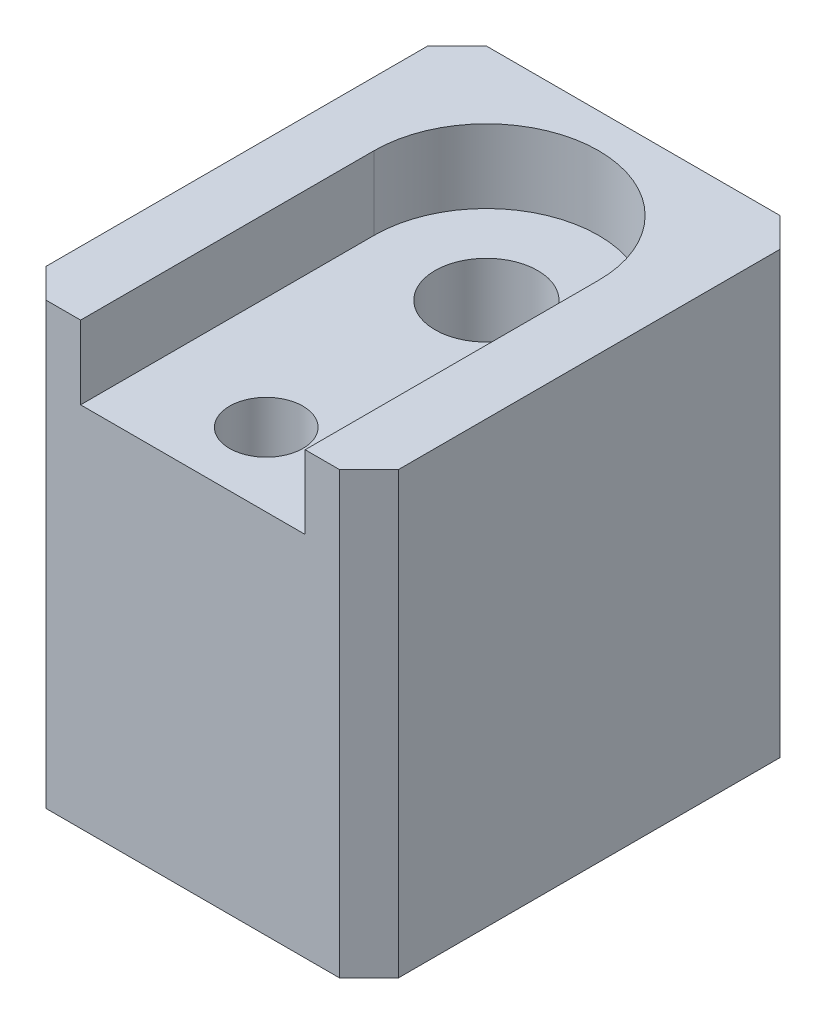
ISO-10303-21;
HEADER;
FILE_DESCRIPTION(('STEP AP214'),'2;1');
FILE_NAME('part.step','',(''),(''),'','','');
FILE_SCHEMA(('AUTOMOTIVE_DESIGN { 1 0 10303 214 1 1 1 1 }'));
ENDSEC;
DATA;
#1=APPLICATION_CONTEXT('core data for automotive mechanical design processes');
#2=APPLICATION_PROTOCOL_DEFINITION('international standard','automotive_design',2000,#1);
#3=PRODUCT_CONTEXT('',#1,'mechanical');
#4=PRODUCT('Part','Part','',(#3));
#5=PRODUCT_RELATED_PRODUCT_CATEGORY('part','',(#4));
#6=PRODUCT_DEFINITION_FORMATION('','',#4);
#7=PRODUCT_DEFINITION_CONTEXT('part definition',#1,'design');
#8=PRODUCT_DEFINITION('design','',#6,#7);
#9=PRODUCT_DEFINITION_SHAPE('','',#8);
#10=(LENGTH_UNIT() NAMED_UNIT(*) SI_UNIT(.MILLI.,.METRE.));
#11=(NAMED_UNIT(*) PLANE_ANGLE_UNIT() SI_UNIT($,.RADIAN.));
#12=(NAMED_UNIT(*) SI_UNIT($,.STERADIAN.) SOLID_ANGLE_UNIT());
#13=UNCERTAINTY_MEASURE_WITH_UNIT(LENGTH_MEASURE(1.E-05),#10,'distance_accuracy_value','');
#14=(GEOMETRIC_REPRESENTATION_CONTEXT(3) GLOBAL_UNCERTAINTY_ASSIGNED_CONTEXT((#13)) GLOBAL_UNIT_ASSIGNED_CONTEXT((#10,
#11,#12)) REPRESENTATION_CONTEXT('',''));
#15=CARTESIAN_POINT('',(0.,0.,0.));
#16=DIRECTION('',(0.,0.,1.));
#17=DIRECTION('',(1.,0.,0.));
#18=AXIS2_PLACEMENT_3D('',#15,#16,#17);
#19=CARTESIAN_POINT('',(5.,15.,-7.5));
#20=DIRECTION('',(-0.707106781186549,0.,0.707106781186546));
#21=DIRECTION('',(0.,1.,0.));
#22=AXIS2_PLACEMENT_3D('',#19,#20,#21);
#23=PLANE('',#22);
#24=DIRECTION('',(-0.707106781186546,0.,-0.707106781186549));
#25=VECTOR('',#24,1.);
#26=CARTESIAN_POINT('',(6.25,15.,-6.25));
#27=LINE('',#26,#25);
#28=CARTESIAN_POINT('',(6.,15.,-6.5));
#29=VERTEX_POINT('',#28);
#30=CARTESIAN_POINT('',(5.,15.,-7.5));
#31=VERTEX_POINT('',#30);
#32=EDGE_CURVE('E222',#29,#31,#27,.T.);
#33=ORIENTED_EDGE('',*,*,#32,.F.);
#34=DIRECTION('',(0.,1.,0.));
#35=VECTOR('',#34,1.);
#36=CARTESIAN_POINT('',(6.,15.,-6.5));
#37=LINE('',#36,#35);
#38=CARTESIAN_POINT('',(6.,0.,-6.5));
#39=VERTEX_POINT('',#38);
#40=EDGE_CURVE('E209',#39,#29,#37,.T.);
#41=ORIENTED_EDGE('',*,*,#40,.F.);
#42=DIRECTION('',(0.707106781186546,0.,0.707106781186549));
#43=VECTOR('',#42,1.);
#44=CARTESIAN_POINT('',(5.,0.,-7.5));
#45=LINE('',#44,#43);
#46=CARTESIAN_POINT('',(5.,0.,-7.5));
#47=VERTEX_POINT('',#46);
#48=EDGE_CURVE('E167',#47,#39,#45,.T.);
#49=ORIENTED_EDGE('',*,*,#48,.F.);
#50=DIRECTION('',(0.,-1.,0.));
#51=VECTOR('',#50,1.);
#52=CARTESIAN_POINT('',(5.,15.,-7.5));
#53=LINE('',#52,#51);
#54=EDGE_CURVE('E254',#31,#47,#53,.T.);
#55=ORIENTED_EDGE('',*,*,#54,.F.);
#56=EDGE_LOOP('',(#33,#41,#49,#55));
#57=FACE_BOUND('',#56,.T.);
#58=ADVANCED_FACE('F17',(#57),#23,.F.);
#59=CARTESIAN_POINT('',(-6.,15.,-6.5));
#60=DIRECTION('',(0.707106781186546,0.,0.707106781186549));
#61=DIRECTION('',(0.,-1.,0.));
#62=AXIS2_PLACEMENT_3D('',#59,#60,#61);
#63=PLANE('',#62);
#64=DIRECTION('',(-0.707106781186549,0.,0.707106781186546));
#65=VECTOR('',#64,1.);
#66=CARTESIAN_POINT('',(-6.25,15.,-6.25));
#67=LINE('',#66,#65);
#68=CARTESIAN_POINT('',(-5.,15.,-7.5));
#69=VERTEX_POINT('',#68);
#70=CARTESIAN_POINT('',(-6.,15.,-6.5));
#71=VERTEX_POINT('',#70);
#72=EDGE_CURVE('E219',#69,#71,#67,.T.);
#73=ORIENTED_EDGE('',*,*,#72,.F.);
#74=DIRECTION('',(0.,1.,0.));
#75=VECTOR('',#74,1.);
#76=CARTESIAN_POINT('',(-5.,15.,-7.5));
#77=LINE('',#76,#75);
#78=CARTESIAN_POINT('',(-5.,0.,-7.5));
#79=VERTEX_POINT('',#78);
#80=EDGE_CURVE('E161',#79,#69,#77,.T.);
#81=ORIENTED_EDGE('',*,*,#80,.F.);
#82=DIRECTION('',(0.707106781186549,0.,-0.707106781186546));
#83=VECTOR('',#82,1.);
#84=CARTESIAN_POINT('',(-6.,0.,-6.5));
#85=LINE('',#84,#83);
#86=CARTESIAN_POINT('',(-6.,0.,-6.5));
#87=VERTEX_POINT('',#86);
#88=EDGE_CURVE('E155',#87,#79,#85,.T.);
#89=ORIENTED_EDGE('',*,*,#88,.F.);
#90=DIRECTION('',(0.,-1.,0.));
#91=VECTOR('',#90,1.);
#92=CARTESIAN_POINT('',(-6.,15.,-6.5));
#93=LINE('',#92,#91);
#94=EDGE_CURVE('E158',#71,#87,#93,.T.);
#95=ORIENTED_EDGE('',*,*,#94,.F.);
#96=EDGE_LOOP('',(#73,#81,#89,#95));
#97=FACE_BOUND('',#96,.T.);
#98=ADVANCED_FACE('F157',(#97),#63,.F.);
#99=CARTESIAN_POINT('',(6.,15.,6.5));
#100=DIRECTION('',(-0.707106781186546,0.,-0.707106781186549));
#101=DIRECTION('',(-0.707106781186549,0.,0.707106781186546));
#102=AXIS2_PLACEMENT_3D('',#99,#100,#101);
#103=PLANE('',#102);
#104=DIRECTION('',(0.707106781186549,0.,-0.707106781186546));
#105=VECTOR('',#104,1.);
#106=CARTESIAN_POINT('',(6.25,15.,6.25));
#107=LINE('',#106,#105);
#108=CARTESIAN_POINT('',(5.,15.,7.5));
#109=VERTEX_POINT('',#108);
#110=CARTESIAN_POINT('',(6.,15.,6.5));
#111=VERTEX_POINT('',#110);
#112=EDGE_CURVE('E272',#109,#111,#107,.T.);
#113=ORIENTED_EDGE('',*,*,#112,.F.);
#114=DIRECTION('',(0.,1.,0.));
#115=VECTOR('',#114,1.);
#116=CARTESIAN_POINT('',(5.,15.,7.5));
#117=LINE('',#116,#115);
#118=CARTESIAN_POINT('',(5.,0.,7.5));
#119=VERTEX_POINT('',#118);
#120=EDGE_CURVE('E201',#119,#109,#117,.T.);
#121=ORIENTED_EDGE('',*,*,#120,.F.);
#122=DIRECTION('',(-0.707106781186549,0.,0.707106781186546));
#123=VECTOR('',#122,1.);
#124=CARTESIAN_POINT('',(6.,0.,6.5));
#125=LINE('',#124,#123);
#126=CARTESIAN_POINT('',(6.,0.,6.5));
#127=VERTEX_POINT('',#126);
#128=EDGE_CURVE('E281',#127,#119,#125,.T.);
#129=ORIENTED_EDGE('',*,*,#128,.F.);
#130=DIRECTION('',(0.,-1.,0.));
#131=VECTOR('',#130,1.);
#132=CARTESIAN_POINT('',(6.,15.,6.5));
#133=LINE('',#132,#131);
#134=EDGE_CURVE('E210',#111,#127,#133,.T.);
#135=ORIENTED_EDGE('',*,*,#134,.F.);
#136=EDGE_LOOP('',(#113,#121,#129,#135));
#137=FACE_BOUND('',#136,.T.);
#138=ADVANCED_FACE('F631',(#137),#103,.F.);
#139=CARTESIAN_POINT('',(-5.,15.,7.5));
#140=DIRECTION('',(0.707106781186549,0.,-0.707106781186546));
#141=DIRECTION('',(0.,-1.,0.));
#142=AXIS2_PLACEMENT_3D('',#139,#140,#141);
#143=PLANE('',#142);
#144=DIRECTION('',(0.707106781186546,0.,0.707106781186549));
#145=VECTOR('',#144,1.);
#146=CARTESIAN_POINT('',(-6.25,15.,6.25));
#147=LINE('',#146,#145);
#148=CARTESIAN_POINT('',(-6.,15.,6.5));
#149=VERTEX_POINT('',#148);
#150=CARTESIAN_POINT('',(-5.,15.,7.5));
#151=VERTEX_POINT('',#150);
#152=EDGE_CURVE('E258',#149,#151,#147,.T.);
#153=ORIENTED_EDGE('',*,*,#152,.F.);
#154=DIRECTION('',(0.,1.,0.));
#155=VECTOR('',#154,1.);
#156=CARTESIAN_POINT('',(-6.,15.,6.5));
#157=LINE('',#156,#155);
#158=CARTESIAN_POINT('',(-6.,0.,6.5));
#159=VERTEX_POINT('',#158);
#160=EDGE_CURVE('E184',#159,#149,#157,.T.);
#161=ORIENTED_EDGE('',*,*,#160,.F.);
#162=DIRECTION('',(-0.707106781186546,0.,-0.707106781186549));
#163=VECTOR('',#162,1.);
#164=CARTESIAN_POINT('',(-5.,0.,7.5));
#165=LINE('',#164,#163);
#166=CARTESIAN_POINT('',(-5.,0.,7.5));
#167=VERTEX_POINT('',#166);
#168=EDGE_CURVE('E168',#167,#159,#165,.T.);
#169=ORIENTED_EDGE('',*,*,#168,.F.);
#170=DIRECTION('',(0.,-1.,0.));
#171=VECTOR('',#170,1.);
#172=CARTESIAN_POINT('',(-5.,15.,7.5));
#173=LINE('',#172,#171);
#174=EDGE_CURVE('E202',#151,#167,#173,.T.);
#175=ORIENTED_EDGE('',*,*,#174,.F.);
#176=EDGE_LOOP('',(#153,#161,#169,#175));
#177=FACE_BOUND('',#176,.T.);
#178=ADVANCED_FACE('F622',(#177),#143,.F.);
#179=CARTESIAN_POINT('',(0.,0.,5.));
#180=DIRECTION('',(0.,-1.,0.));
#181=DIRECTION('',(0.,0.,-1.));
#182=AXIS2_PLACEMENT_3D('',#179,#180,#181);
#183=CONICAL_SURFACE('',#182,1.525,0.785398163397447);
#184=CARTESIAN_POINT('',(0.,0.275,5.));
#185=DIRECTION('',(0.,-1.,0.));
#186=DIRECTION('',(0.,0.,-1.));
#187=AXIS2_PLACEMENT_3D('',#184,#185,#186);
#188=CIRCLE('',#187,1.25);
#189=CARTESIAN_POINT('',(0.,0.275,3.75));
#190=VERTEX_POINT('',#189);
#191=EDGE_CURVE('E11',#190,#190,#188,.T.);
#192=ORIENTED_EDGE('',*,*,#191,.F.);
#193=EDGE_LOOP('',(#192));
#194=FACE_BOUND('',#193,.T.);
#195=CARTESIAN_POINT('',(0.,0.,5.));
#196=DIRECTION('',(0.,-1.,0.));
#197=DIRECTION('',(0.,0.,-1.));
#198=AXIS2_PLACEMENT_3D('',#195,#196,#197);
#199=CIRCLE('',#198,1.525);
#200=CARTESIAN_POINT('',(0.,0.,3.475));
#201=VERTEX_POINT('',#200);
#202=EDGE_CURVE('E284',#201,#201,#199,.T.);
#203=ORIENTED_EDGE('',*,*,#202,.T.);
#204=EDGE_LOOP('',(#203));
#205=FACE_BOUND('',#204,.T.);
#206=ADVANCED_FACE('F557',(#194,#205),#183,.F.);
#207=CARTESIAN_POINT('',(0.,0.,5.));
#208=DIRECTION('',(0.,-1.,0.));
#209=DIRECTION('',(0.,0.,-1.));
#210=AXIS2_PLACEMENT_3D('',#207,#208,#209);
#211=CYLINDRICAL_SURFACE('',#210,1.25);
#212=CARTESIAN_POINT('',(0.,12.5,5.));
#213=DIRECTION('',(0.,1.,0.));
#214=DIRECTION('',(0.,0.,1.));
#215=AXIS2_PLACEMENT_3D('',#212,#213,#214);
#216=CIRCLE('',#215,1.25);
#217=CARTESIAN_POINT('',(0.,12.5,6.25));
#218=VERTEX_POINT('',#217);
#219=EDGE_CURVE('E304',#218,#218,#216,.T.);
#220=ORIENTED_EDGE('',*,*,#219,.T.);
#221=EDGE_LOOP('',(#220));
#222=FACE_BOUND('',#221,.T.);
#223=ORIENTED_EDGE('',*,*,#191,.T.);
#224=EDGE_LOOP('',(#223));
#225=FACE_BOUND('',#224,.T.);
#226=ADVANCED_FACE('F552',(#222,#225),#211,.F.);
#227=CARTESIAN_POINT('',(0.,0.,-2.5));
#228=DIRECTION('',(0.,-1.,0.));
#229=DIRECTION('',(0.,0.,-1.));
#230=AXIS2_PLACEMENT_3D('',#227,#228,#229);
#231=CYLINDRICAL_SURFACE('',#230,1.75);
#232=CARTESIAN_POINT('',(0.,12.5,-2.5));
#233=DIRECTION('',(0.,1.,0.));
#234=DIRECTION('',(0.,0.,1.));
#235=AXIS2_PLACEMENT_3D('',#232,#233,#234);
#236=CIRCLE('',#235,1.75);
#237=CARTESIAN_POINT('',(0.,12.5,-0.749999999999986));
#238=VERTEX_POINT('',#237);
#239=EDGE_CURVE('E42',#238,#238,#236,.T.);
#240=ORIENTED_EDGE('',*,*,#239,.T.);
#241=EDGE_LOOP('',(#240));
#242=FACE_BOUND('',#241,.T.);
#243=CARTESIAN_POINT('',(0.,0.,-2.5));
#244=DIRECTION('',(0.,-1.,0.));
#245=DIRECTION('',(0.,0.,-1.));
#246=AXIS2_PLACEMENT_3D('',#243,#244,#245);
#247=CIRCLE('',#246,1.75);
#248=CARTESIAN_POINT('',(0.,0.,-4.25));
#249=VERTEX_POINT('',#248);
#250=EDGE_CURVE('E287',#249,#249,#247,.T.);
#251=ORIENTED_EDGE('',*,*,#250,.T.);
#252=EDGE_LOOP('',(#251));
#253=FACE_BOUND('',#252,.T.);
#254=ADVANCED_FACE('F556',(#242,#253),#231,.F.);
#255=CARTESIAN_POINT('',(3.825,12.5,7.5));
#256=DIRECTION('',(1.,0.,0.));
#257=DIRECTION('',(0.,0.,-1.));
#258=AXIS2_PLACEMENT_3D('',#255,#256,#257);
#259=PLANE('',#258);
#260=DIRECTION('',(0.,0.,-1.));
#261=VECTOR('',#260,1.);
#262=CARTESIAN_POINT('',(3.825,15.,7.5));
#263=LINE('',#262,#261);
#264=CARTESIAN_POINT('',(3.825,15.,7.5));
#265=VERTEX_POINT('',#264);
#266=CARTESIAN_POINT('',(3.825,15.,-2.5));
#267=VERTEX_POINT('',#266);
#268=EDGE_CURVE('E268',#265,#267,#263,.T.);
#269=ORIENTED_EDGE('',*,*,#268,.T.);
#270=DIRECTION('',(0.,1.,0.));
#271=VECTOR('',#270,1.);
#272=CARTESIAN_POINT('',(3.825,12.5,-2.5));
#273=LINE('',#272,#271);
#274=CARTESIAN_POINT('',(3.825,12.5,-2.5));
#275=VERTEX_POINT('',#274);
#276=EDGE_CURVE('E25',#275,#267,#273,.T.);
#277=ORIENTED_EDGE('',*,*,#276,.F.);
#278=DIRECTION('',(0.,0.,-1.));
#279=VECTOR('',#278,1.);
#280=CARTESIAN_POINT('',(3.825,12.5,7.5));
#281=LINE('',#280,#279);
#282=CARTESIAN_POINT('',(3.825,12.5,7.5));
#283=VERTEX_POINT('',#282);
#284=EDGE_CURVE('E290',#283,#275,#281,.T.);
#285=ORIENTED_EDGE('',*,*,#284,.F.);
#286=DIRECTION('',(0.,1.,0.));
#287=VECTOR('',#286,1.);
#288=CARTESIAN_POINT('',(3.825,12.5,7.5));
#289=LINE('',#288,#287);
#290=EDGE_CURVE('E197',#283,#265,#289,.T.);
#291=ORIENTED_EDGE('',*,*,#290,.T.);
#292=EDGE_LOOP('',(#269,#277,#285,#291));
#293=FACE_BOUND('',#292,.T.);
#294=ADVANCED_FACE('F571',(#293),#259,.F.);
#295=CARTESIAN_POINT('',(0.,12.5,-2.5));
#296=DIRECTION('',(0.,1.,0.));
#297=DIRECTION('',(0.,0.,1.));
#298=AXIS2_PLACEMENT_3D('',#295,#296,#297);
#299=CYLINDRICAL_SURFACE('',#298,3.825);
#300=CARTESIAN_POINT('',(0.,15.,-2.5));
#301=DIRECTION('',(0.,1.,0.));
#302=DIRECTION('',(0.,0.,1.));
#303=AXIS2_PLACEMENT_3D('',#300,#301,#302);
#304=CIRCLE('',#303,3.825);
#305=CARTESIAN_POINT('',(-3.825,15.,-2.5));
#306=VERTEX_POINT('',#305);
#307=EDGE_CURVE('E264',#267,#306,#304,.T.);
#308=ORIENTED_EDGE('',*,*,#307,.T.);
#309=DIRECTION('',(0.,1.,0.));
#310=VECTOR('',#309,1.);
#311=CARTESIAN_POINT('',(-3.825,12.5,-2.5));
#312=LINE('',#311,#310);
#313=CARTESIAN_POINT('',(-3.825,12.5,-2.5));
#314=VERTEX_POINT('',#313);
#315=EDGE_CURVE('E291',#314,#306,#312,.T.);
#316=ORIENTED_EDGE('',*,*,#315,.F.);
#317=CARTESIAN_POINT('',(0.,12.5,-2.5));
#318=DIRECTION('',(0.,1.,0.));
#319=DIRECTION('',(0.,0.,1.));
#320=AXIS2_PLACEMENT_3D('',#317,#318,#319);
#321=CIRCLE('',#320,3.825);
#322=EDGE_CURVE('E297',#275,#314,#321,.T.);
#323=ORIENTED_EDGE('',*,*,#322,.F.);
#324=ORIENTED_EDGE('',*,*,#276,.T.);
#325=EDGE_LOOP('',(#308,#316,#323,#324));
#326=FACE_BOUND('',#325,.T.);
#327=ADVANCED_FACE('F519',(#326),#299,.F.);
#328=CARTESIAN_POINT('',(-3.825,12.5,7.5));
#329=DIRECTION('',(-1.,0.,0.));
#330=DIRECTION('',(0.,1.,0.));
#331=AXIS2_PLACEMENT_3D('',#328,#329,#330);
#332=PLANE('',#331);
#333=DIRECTION('',(0.,0.,1.));
#334=VECTOR('',#333,1.);
#335=CARTESIAN_POINT('',(-3.825,15.,7.5));
#336=LINE('',#335,#334);
#337=CARTESIAN_POINT('',(-3.825,15.,7.5));
#338=VERTEX_POINT('',#337);
#339=EDGE_CURVE('E261',#306,#338,#336,.T.);
#340=ORIENTED_EDGE('',*,*,#339,.T.);
#341=DIRECTION('',(0.,1.,0.));
#342=VECTOR('',#341,1.);
#343=CARTESIAN_POINT('',(-3.825,12.5,7.5));
#344=LINE('',#343,#342);
#345=CARTESIAN_POINT('',(-3.825,12.5,7.5));
#346=VERTEX_POINT('',#345);
#347=EDGE_CURVE('E196',#346,#338,#344,.T.);
#348=ORIENTED_EDGE('',*,*,#347,.F.);
#349=DIRECTION('',(0.,0.,1.));
#350=VECTOR('',#349,1.);
#351=CARTESIAN_POINT('',(-3.825,12.5,7.5));
#352=LINE('',#351,#350);
#353=EDGE_CURVE('E303',#314,#346,#352,.T.);
#354=ORIENTED_EDGE('',*,*,#353,.F.);
#355=ORIENTED_EDGE('',*,*,#315,.T.);
#356=EDGE_LOOP('',(#340,#348,#354,#355));
#357=FACE_BOUND('',#356,.T.);
#358=ADVANCED_FACE('F514',(#357),#332,.F.);
#359=CARTESIAN_POINT('',(0.,12.5,7.5));
#360=DIRECTION('',(0.,1.,0.));
#361=DIRECTION('',(1.,0.,0.));
#362=AXIS2_PLACEMENT_3D('',#359,#360,#361);
#363=PLANE('',#362);
#364=ORIENTED_EDGE('',*,*,#239,.F.);
#365=EDGE_LOOP('',(#364));
#366=FACE_BOUND('',#365,.T.);
#367=ORIENTED_EDGE('',*,*,#219,.F.);
#368=EDGE_LOOP('',(#367));
#369=FACE_BOUND('',#368,.T.);
#370=DIRECTION('',(1.,0.,0.));
#371=VECTOR('',#370,1.);
#372=CARTESIAN_POINT('',(6.,12.5,7.5));
#373=LINE('',#372,#371);
#374=EDGE_CURVE('E192',#346,#283,#373,.T.);
#375=ORIENTED_EDGE('',*,*,#374,.T.);
#376=ORIENTED_EDGE('',*,*,#284,.T.);
#377=ORIENTED_EDGE('',*,*,#322,.T.);
#378=ORIENTED_EDGE('',*,*,#353,.T.);
#379=EDGE_LOOP('',(#375,#376,#377,#378));
#380=FACE_BOUND('',#379,.T.);
#381=ADVANCED_FACE('F518',(#366,#369,#380),#363,.T.);
#382=CARTESIAN_POINT('',(0.,0.,0.));
#383=DIRECTION('',(0.,1.,0.));
#384=DIRECTION('',(1.,0.,0.));
#385=AXIS2_PLACEMENT_3D('',#382,#383,#384);
#386=PLANE('',#385);
#387=ORIENTED_EDGE('',*,*,#250,.F.);
#388=EDGE_LOOP('',(#387));
#389=FACE_BOUND('',#388,.T.);
#390=ORIENTED_EDGE('',*,*,#202,.F.);
#391=EDGE_LOOP('',(#390));
#392=FACE_BOUND('',#391,.T.);
#393=DIRECTION('',(1.,0.,0.));
#394=VECTOR('',#393,1.);
#395=CARTESIAN_POINT('',(6.,0.,7.5));
#396=LINE('',#395,#394);
#397=EDGE_CURVE('E198',#167,#119,#396,.T.);
#398=ORIENTED_EDGE('',*,*,#397,.F.);
#399=ORIENTED_EDGE('',*,*,#168,.T.);
#400=DIRECTION('',(0.,0.,1.));
#401=VECTOR('',#400,1.);
#402=CARTESIAN_POINT('',(-6.,0.,7.5));
#403=LINE('',#402,#401);
#404=EDGE_CURVE('E174',#87,#159,#403,.T.);
#405=ORIENTED_EDGE('',*,*,#404,.F.);
#406=ORIENTED_EDGE('',*,*,#88,.T.);
#407=DIRECTION('',(-1.,0.,0.));
#408=VECTOR('',#407,1.);
#409=CARTESIAN_POINT('',(6.,0.,-7.5));
#410=LINE('',#409,#408);
#411=EDGE_CURVE('E239',#47,#79,#410,.T.);
#412=ORIENTED_EDGE('',*,*,#411,.F.);
#413=ORIENTED_EDGE('',*,*,#48,.T.);
#414=DIRECTION('',(0.,0.,-1.));
#415=VECTOR('',#414,1.);
#416=CARTESIAN_POINT('',(6.,0.,7.5));
#417=LINE('',#416,#415);
#418=EDGE_CURVE('E206',#127,#39,#417,.T.);
#419=ORIENTED_EDGE('',*,*,#418,.F.);
#420=ORIENTED_EDGE('',*,*,#128,.T.);
#421=EDGE_LOOP('',(#398,#399,#405,#406,#412,#413,#419,#420));
#422=FACE_BOUND('',#421,.T.);
#423=ADVANCED_FACE('F181',(#389,#392,#422),#386,.F.);
#424=CARTESIAN_POINT('',(0.,15.,0.));
#425=DIRECTION('',(0.,1.,0.));
#426=DIRECTION('',(1.,0.,0.));
#427=AXIS2_PLACEMENT_3D('',#424,#425,#426);
#428=PLANE('',#427);
#429=DIRECTION('',(0.,0.,1.));
#430=VECTOR('',#429,1.);
#431=CARTESIAN_POINT('',(-6.,15.,7.5));
#432=LINE('',#431,#430);
#433=EDGE_CURVE('E176',#71,#149,#432,.T.);
#434=ORIENTED_EDGE('',*,*,#433,.T.);
#435=ORIENTED_EDGE('',*,*,#152,.T.);
#436=DIRECTION('',(1.,0.,0.));
#437=VECTOR('',#436,1.);
#438=CARTESIAN_POINT('',(6.,15.,7.5));
#439=LINE('',#438,#437);
#440=EDGE_CURVE('E178',#151,#338,#439,.T.);
#441=ORIENTED_EDGE('',*,*,#440,.T.);
#442=ORIENTED_EDGE('',*,*,#339,.F.);
#443=ORIENTED_EDGE('',*,*,#307,.F.);
#444=ORIENTED_EDGE('',*,*,#268,.F.);
#445=DIRECTION('',(1.,0.,0.));
#446=VECTOR('',#445,1.);
#447=CARTESIAN_POINT('',(6.,15.,7.5));
#448=LINE('',#447,#446);
#449=EDGE_CURVE('E229',#265,#109,#448,.T.);
#450=ORIENTED_EDGE('',*,*,#449,.T.);
#451=ORIENTED_EDGE('',*,*,#112,.T.);
#452=DIRECTION('',(0.,0.,-1.));
#453=VECTOR('',#452,1.);
#454=CARTESIAN_POINT('',(6.,15.,7.5));
#455=LINE('',#454,#453);
#456=EDGE_CURVE('E215',#111,#29,#455,.T.);
#457=ORIENTED_EDGE('',*,*,#456,.T.);
#458=ORIENTED_EDGE('',*,*,#32,.T.);
#459=DIRECTION('',(-1.,0.,0.));
#460=VECTOR('',#459,1.);
#461=CARTESIAN_POINT('',(6.,15.,-7.5));
#462=LINE('',#461,#460);
#463=EDGE_CURVE('E250',#31,#69,#462,.T.);
#464=ORIENTED_EDGE('',*,*,#463,.T.);
#465=ORIENTED_EDGE('',*,*,#72,.T.);
#466=EDGE_LOOP('',(#434,#435,#441,#442,#443,#444,#450,#451,#457,#458,#464,#465));
#467=FACE_BOUND('',#466,.T.);
#468=ADVANCED_FACE('F542',(#467),#428,.T.);
#469=CARTESIAN_POINT('',(6.,15.,-7.5));
#470=DIRECTION('',(0.,0.,1.));
#471=DIRECTION('',(1.,0.,0.));
#472=AXIS2_PLACEMENT_3D('',#469,#470,#471);
#473=PLANE('',#472);
#474=ORIENTED_EDGE('',*,*,#411,.T.);
#475=ORIENTED_EDGE('',*,*,#80,.T.);
#476=ORIENTED_EDGE('',*,*,#463,.F.);
#477=ORIENTED_EDGE('',*,*,#54,.T.);
#478=EDGE_LOOP('',(#474,#475,#476,#477));
#479=FACE_BOUND('',#478,.T.);
#480=ADVANCED_FACE('F546',(#479),#473,.F.);
#481=CARTESIAN_POINT('',(6.,15.,7.5));
#482=DIRECTION('',(-1.,0.,0.));
#483=DIRECTION('',(0.,0.,1.));
#484=AXIS2_PLACEMENT_3D('',#481,#482,#483);
#485=PLANE('',#484);
#486=ORIENTED_EDGE('',*,*,#456,.F.);
#487=ORIENTED_EDGE('',*,*,#134,.T.);
#488=ORIENTED_EDGE('',*,*,#418,.T.);
#489=ORIENTED_EDGE('',*,*,#40,.T.);
#490=EDGE_LOOP('',(#486,#487,#488,#489));
#491=FACE_BOUND('',#490,.T.);
#492=ADVANCED_FACE('F536',(#491),#485,.F.);
#493=CARTESIAN_POINT('',(6.,15.,7.5));
#494=DIRECTION('',(0.,0.,-1.));
#495=DIRECTION('',(-1.,0.,0.));
#496=AXIS2_PLACEMENT_3D('',#493,#494,#495);
#497=PLANE('',#496);
#498=ORIENTED_EDGE('',*,*,#440,.F.);
#499=ORIENTED_EDGE('',*,*,#174,.T.);
#500=ORIENTED_EDGE('',*,*,#397,.T.);
#501=ORIENTED_EDGE('',*,*,#120,.T.);
#502=ORIENTED_EDGE('',*,*,#449,.F.);
#503=ORIENTED_EDGE('',*,*,#290,.F.);
#504=ORIENTED_EDGE('',*,*,#374,.F.);
#505=ORIENTED_EDGE('',*,*,#347,.T.);
#506=EDGE_LOOP('',(#498,#499,#500,#501,#502,#503,#504,#505));
#507=FACE_BOUND('',#506,.T.);
#508=ADVANCED_FACE('F528',(#507),#497,.F.);
#509=CARTESIAN_POINT('',(-6.,15.,7.5));
#510=DIRECTION('',(1.,0.,0.));
#511=DIRECTION('',(0.,1.,0.));
#512=AXIS2_PLACEMENT_3D('',#509,#510,#511);
#513=PLANE('',#512);
#514=ORIENTED_EDGE('',*,*,#404,.T.);
#515=ORIENTED_EDGE('',*,*,#160,.T.);
#516=ORIENTED_EDGE('',*,*,#433,.F.);
#517=ORIENTED_EDGE('',*,*,#94,.T.);
#518=EDGE_LOOP('',(#514,#515,#516,#517));
#519=FACE_BOUND('',#518,.T.);
#520=ADVANCED_FACE('F172',(#519),#513,.F.);
#521=CLOSED_SHELL('',(#58,#98,#138,#178,#206,#226,#254,#294,#327,#358,#381,#423,#468,#480,#492,
#508,#520));
#522=MANIFOLD_SOLID_BREP('B1',#521);
#523=ADVANCED_BREP_SHAPE_REPRESENTATION('',(#18,#522),#14);
#524=SHAPE_DEFINITION_REPRESENTATION(#9,#523);
ENDSEC;
END-ISO-10303-21;
